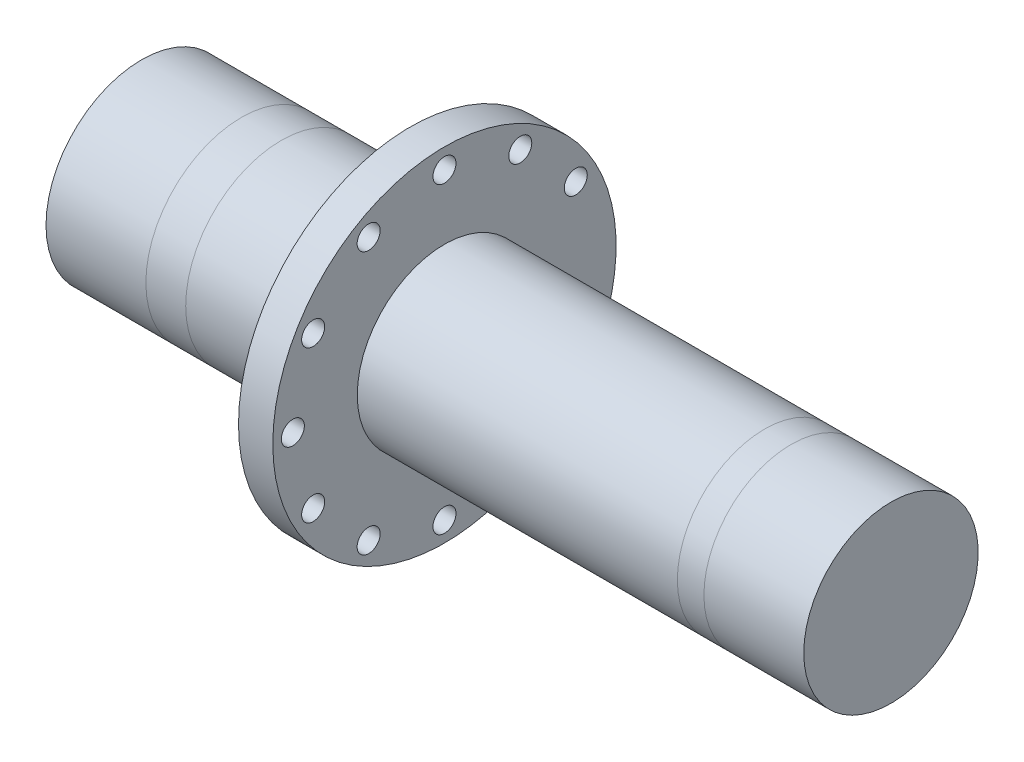
ISO-10303-21;
HEADER;
FILE_DESCRIPTION(('STEP AP214'),'2;1');
FILE_NAME('part.step','',(''),(''),'','','');
FILE_SCHEMA(('AUTOMOTIVE_DESIGN { 1 0 10303 214 1 1 1 1 }'));
ENDSEC;
DATA;
#1=APPLICATION_CONTEXT('core data for automotive mechanical design processes');
#2=APPLICATION_PROTOCOL_DEFINITION('international standard','automotive_design',2000,#1);
#3=PRODUCT_CONTEXT('',#1,'mechanical');
#4=PRODUCT('Part','Part','',(#3));
#5=PRODUCT_RELATED_PRODUCT_CATEGORY('part','',(#4));
#6=PRODUCT_DEFINITION_FORMATION('','',#4);
#7=PRODUCT_DEFINITION_CONTEXT('part definition',#1,'design');
#8=PRODUCT_DEFINITION('design','',#6,#7);
#9=PRODUCT_DEFINITION_SHAPE('','',#8);
#10=(LENGTH_UNIT() NAMED_UNIT(*) SI_UNIT(.MILLI.,.METRE.));
#11=(NAMED_UNIT(*) PLANE_ANGLE_UNIT() SI_UNIT($,.RADIAN.));
#12=(NAMED_UNIT(*) SI_UNIT($,.STERADIAN.) SOLID_ANGLE_UNIT());
#13=UNCERTAINTY_MEASURE_WITH_UNIT(LENGTH_MEASURE(1.E-05),#10,'distance_accuracy_value','');
#14=(GEOMETRIC_REPRESENTATION_CONTEXT(3) GLOBAL_UNCERTAINTY_ASSIGNED_CONTEXT((#13)) GLOBAL_UNIT_ASSIGNED_CONTEXT((#10,
#11,#12)) REPRESENTATION_CONTEXT('',''));
#15=CARTESIAN_POINT('',(0.,0.,0.));
#16=DIRECTION('',(0.,0.,1.));
#17=DIRECTION('',(1.,0.,0.));
#18=AXIS2_PLACEMENT_3D('',#15,#16,#17);
#19=CARTESIAN_POINT('',(0.,0.,0.));
#20=DIRECTION('',(-1.,0.,0.));
#21=DIRECTION('',(0.,0.,1.));
#22=AXIS2_PLACEMENT_3D('',#19,#20,#21);
#23=CYLINDRICAL_SURFACE('',#22,25.019);
#24=CARTESIAN_POINT('',(178.729999896,0.,0.));
#25=DIRECTION('',(-1.,0.,0.));
#26=DIRECTION('',(0.,0.,-1.));
#27=AXIS2_PLACEMENT_3D('',#24,#25,#26);
#28=CIRCLE('',#27,25.019);
#29=CARTESIAN_POINT('',(178.729999896,0.,-25.019));
#30=VERTEX_POINT('',#29);
#31=EDGE_CURVE('E65',#30,#30,#28,.T.);
#32=ORIENTED_EDGE('',*,*,#31,.F.);
#33=EDGE_LOOP('',(#32));
#34=FACE_BOUND('',#33,.T.);
#35=CARTESIAN_POINT('',(186.349999896,0.,0.));
#36=DIRECTION('',(-1.,0.,0.));
#37=DIRECTION('',(0.,0.,-1.));
#38=AXIS2_PLACEMENT_3D('',#35,#36,#37);
#39=CIRCLE('',#38,25.019);
#40=CARTESIAN_POINT('',(186.349999896,0.,-25.019));
#41=VERTEX_POINT('',#40);
#42=EDGE_CURVE('E12',#41,#41,#39,.T.);
#43=ORIENTED_EDGE('',*,*,#42,.T.);
#44=EDGE_LOOP('',(#43));
#45=FACE_BOUND('',#44,.T.);
#46=ADVANCED_FACE('F55',(#34,#45),#23,.T.);
#47=CARTESIAN_POINT('',(86.8925,0.,0.));
#48=DIRECTION('',(-1.,0.,0.));
#49=DIRECTION('',(0.,0.,1.));
#50=AXIS2_PLACEMENT_3D('',#47,#48,#49);
#51=CIRCLE('',#50,25.019);
#52=CARTESIAN_POINT('',(86.8925,0.,25.019));
#53=VERTEX_POINT('',#52);
#54=EDGE_CURVE('E80',#53,#53,#51,.T.);
#55=ORIENTED_EDGE('',*,*,#54,.F.);
#56=EDGE_LOOP('',(#55));
#57=FACE_BOUND('',#56,.T.);
#58=ORIENTED_EDGE('',*,*,#31,.T.);
#59=EDGE_LOOP('',(#58));
#60=FACE_BOUND('',#59,.T.);
#61=ADVANCED_FACE('F141',(#57,#60),#23,.T.);
#62=CARTESIAN_POINT('',(0.,0.,0.));
#63=DIRECTION('',(-1.,0.,0.));
#64=DIRECTION('',(0.,0.,1.));
#65=AXIS2_PLACEMENT_3D('',#62,#63,#64);
#66=CYLINDRICAL_SURFACE('',#65,27.432);
#67=CARTESIAN_POINT('',(77.05,0.,0.));
#68=DIRECTION('',(-1.,0.,0.));
#69=DIRECTION('',(0.,0.,1.));
#70=AXIS2_PLACEMENT_3D('',#67,#68,#69);
#71=CIRCLE('',#70,27.432);
#72=CARTESIAN_POINT('',(77.05,0.,27.432));
#73=VERTEX_POINT('',#72);
#74=EDGE_CURVE('E112',#73,#73,#71,.T.);
#75=ORIENTED_EDGE('',*,*,#74,.T.);
#76=EDGE_LOOP('',(#75));
#77=FACE_BOUND('',#76,.T.);
#78=CARTESIAN_POINT('',(40.080000104,0.,0.));
#79=DIRECTION('',(1.,0.,0.));
#80=DIRECTION('',(0.,0.,1.));
#81=AXIS2_PLACEMENT_3D('',#78,#79,#80);
#82=CIRCLE('',#81,27.432);
#83=CARTESIAN_POINT('',(40.080000104,0.,27.432));
#84=VERTEX_POINT('',#83);
#85=EDGE_CURVE('E70',#84,#84,#82,.T.);
#86=ORIENTED_EDGE('',*,*,#85,.T.);
#87=EDGE_LOOP('',(#86));
#88=FACE_BOUND('',#87,.T.);
#89=ADVANCED_FACE('F150',(#77,#88),#66,.T.);
#90=ORIENTED_EDGE('',*,*,#85,.F.);
#91=EDGE_LOOP('',(#90));
#92=FACE_BOUND('',#91,.T.);
#93=CARTESIAN_POINT('',(28.650000104,0.,0.));
#94=DIRECTION('',(1.,0.,0.));
#95=DIRECTION('',(0.,0.,1.));
#96=AXIS2_PLACEMENT_3D('',#93,#94,#95);
#97=CIRCLE('',#96,27.432);
#98=CARTESIAN_POINT('',(28.650000104,0.,27.432));
#99=VERTEX_POINT('',#98);
#100=EDGE_CURVE('E76',#99,#99,#97,.T.);
#101=ORIENTED_EDGE('',*,*,#100,.T.);
#102=EDGE_LOOP('',(#101));
#103=FACE_BOUND('',#102,.T.);
#104=ADVANCED_FACE('F139',(#92,#103),#66,.T.);
#105=ORIENTED_EDGE('',*,*,#42,.F.);
#106=EDGE_LOOP('',(#105));
#107=FACE_BOUND('',#106,.T.);
#108=CARTESIAN_POINT('',(215.,0.,0.));
#109=DIRECTION('',(-1.,0.,0.));
#110=DIRECTION('',(0.,0.,1.));
#111=AXIS2_PLACEMENT_3D('',#108,#109,#110);
#112=CIRCLE('',#111,25.019);
#113=CARTESIAN_POINT('',(215.,0.,25.019));
#114=VERTEX_POINT('',#113);
#115=EDGE_CURVE('E104',#114,#114,#112,.T.);
#116=ORIENTED_EDGE('',*,*,#115,.T.);
#117=EDGE_LOOP('',(#116));
#118=FACE_BOUND('',#117,.T.);
#119=ADVANCED_FACE('F57',(#107,#118),#23,.T.);
#120=CARTESIAN_POINT('',(86.8925,0.,0.));
#121=DIRECTION('',(1.,0.,0.));
#122=DIRECTION('',(0.,0.,-1.));
#123=AXIS2_PLACEMENT_3D('',#120,#121,#122);
#124=PLANE('',#123);
#125=CARTESIAN_POINT('',(86.8925,-21.7500001666548,-37.6721052312784));
#126=DIRECTION('',(1.,0.,0.));
#127=DIRECTION('',(0.,0.,-1.));
#128=AXIS2_PLACEMENT_3D('',#125,#126,#127);
#129=CIRCLE('',#128,3.29999999999998);
#130=CARTESIAN_POINT('',(86.8925,-21.7500001666548,-40.9721052312783));
#131=VERTEX_POINT('',#130);
#132=EDGE_CURVE('E276',#131,#131,#129,.T.);
#133=ORIENTED_EDGE('',*,*,#132,.F.);
#134=EDGE_LOOP('',(#133));
#135=FACE_BOUND('',#134,.T.);
#136=CARTESIAN_POINT('',(86.8925,-37.6721052759331,-21.7500001220003));
#137=DIRECTION('',(1.,0.,0.));
#138=DIRECTION('',(0.,0.,-1.));
#139=AXIS2_PLACEMENT_3D('',#136,#137,#138);
#140=CIRCLE('',#139,3.29999999999998);
#141=CARTESIAN_POINT('',(86.8925,-37.6721052759331,-25.0500001220003));
#142=VERTEX_POINT('',#141);
#143=EDGE_CURVE('E289',#142,#142,#140,.T.);
#144=ORIENTED_EDGE('',*,*,#143,.F.);
#145=EDGE_LOOP('',(#144));
#146=FACE_BOUND('',#145,.T.);
#147=CARTESIAN_POINT('',(86.8925,-43.5000002276551,-6.10002881540339E-08));
#148=DIRECTION('',(1.,0.,0.));
#149=DIRECTION('',(0.,0.,-1.));
#150=AXIS2_PLACEMENT_3D('',#147,#148,#149);
#151=CIRCLE('',#150,3.29999999999998);
#152=CARTESIAN_POINT('',(86.8925,-43.5000002276551,-3.30000006100026));
#153=VERTEX_POINT('',#152);
#154=EDGE_CURVE('E295',#153,#153,#151,.T.);
#155=ORIENTED_EDGE('',*,*,#154,.F.);
#156=EDGE_LOOP('',(#155));
#157=FACE_BOUND('',#156,.T.);
#158=CARTESIAN_POINT('',(86.8925,-37.6721052759334,21.7499999999998));
#159=DIRECTION('',(1.,0.,0.));
#160=DIRECTION('',(0.,0.,-1.));
#161=AXIS2_PLACEMENT_3D('',#158,#159,#160);
#162=CIRCLE('',#161,3.29999999999998);
#163=CARTESIAN_POINT('',(86.8925,-37.6721052759334,18.4499999999998));
#164=VERTEX_POINT('',#163);
#165=EDGE_CURVE('E302',#164,#164,#162,.T.);
#166=ORIENTED_EDGE('',*,*,#165,.F.);
#167=EDGE_LOOP('',(#166));
#168=FACE_BOUND('',#167,.T.);
#169=CARTESIAN_POINT('',(86.8925,-21.7500001666553,37.6721051092781));
#170=DIRECTION('',(1.,0.,0.));
#171=DIRECTION('',(0.,0.,-1.));
#172=AXIS2_PLACEMENT_3D('',#169,#170,#171);
#173=CIRCLE('',#172,3.29999999999998);
#174=CARTESIAN_POINT('',(86.8925,-21.7500001666553,34.3721051092781));
#175=VERTEX_POINT('',#174);
#176=EDGE_CURVE('E312',#175,#175,#173,.T.);
#177=ORIENTED_EDGE('',*,*,#176,.F.);
#178=EDGE_LOOP('',(#177));
#179=FACE_BOUND('',#178,.T.);
#180=CARTESIAN_POINT('',(86.8925,-1.05655234561297E-07,43.500000061));
#181=DIRECTION('',(1.,0.,0.));
#182=DIRECTION('',(0.,0.,-1.));
#183=AXIS2_PLACEMENT_3D('',#180,#181,#182);
#184=CIRCLE('',#183,3.29999999999998);
#185=CARTESIAN_POINT('',(86.8925,-1.05655234561297E-07,40.200000061));
#186=VERTEX_POINT('',#185);
#187=EDGE_CURVE('E318',#186,#186,#184,.T.);
#188=ORIENTED_EDGE('',*,*,#187,.F.);
#189=EDGE_LOOP('',(#188));
#190=FACE_BOUND('',#189,.T.);
#191=CARTESIAN_POINT('',(86.8925,21.7499999553448,37.6721051092782));
#192=DIRECTION('',(1.,0.,0.));
#193=DIRECTION('',(0.,0.,-1.));
#194=AXIS2_PLACEMENT_3D('',#191,#192,#193);
#195=CIRCLE('',#194,3.29999999999998);
#196=CARTESIAN_POINT('',(86.8925,21.7499999553448,34.3721051092783));
#197=VERTEX_POINT('',#196);
#198=EDGE_CURVE('E325',#197,#197,#195,.T.);
#199=ORIENTED_EDGE('',*,*,#198,.F.);
#200=EDGE_LOOP('',(#199));
#201=FACE_BOUND('',#200,.T.);
#202=CARTESIAN_POINT('',(86.8925,37.6721050646231,21.75));
#203=DIRECTION('',(1.,0.,0.));
#204=DIRECTION('',(0.,0.,-1.));
#205=AXIS2_PLACEMENT_3D('',#202,#203,#204);
#206=CIRCLE('',#205,3.29999999999998);
#207=CARTESIAN_POINT('',(86.8925,37.6721050646231,18.4500000000001));
#208=VERTEX_POINT('',#207);
#209=EDGE_CURVE('E331',#208,#208,#206,.T.);
#210=ORIENTED_EDGE('',*,*,#209,.F.);
#211=EDGE_LOOP('',(#210));
#212=FACE_BOUND('',#211,.T.);
#213=CARTESIAN_POINT('',(86.8925,43.5000000163449,-6.09999828427021E-08));
#214=DIRECTION('',(1.,0.,0.));
#215=DIRECTION('',(0.,0.,-1.));
#216=AXIS2_PLACEMENT_3D('',#213,#214,#215);
#217=CIRCLE('',#216,3.29999999999998);
#218=CARTESIAN_POINT('',(86.8925,43.5000000163449,-3.30000006099996));
#219=VERTEX_POINT('',#218);
#220=EDGE_CURVE('E337',#219,#219,#217,.T.);
#221=ORIENTED_EDGE('',*,*,#220,.F.);
#222=EDGE_LOOP('',(#221));
#223=FACE_BOUND('',#222,.T.);
#224=CARTESIAN_POINT('',(86.8925,37.6721050646231,-21.750000122));
#225=DIRECTION('',(1.,0.,0.));
#226=DIRECTION('',(0.,0.,-1.));
#227=AXIS2_PLACEMENT_3D('',#224,#225,#226);
#228=CIRCLE('',#227,3.29999999999998);
#229=CARTESIAN_POINT('',(86.8925,37.6721050646231,-25.050000122));
#230=VERTEX_POINT('',#229);
#231=EDGE_CURVE('E93',#230,#230,#228,.T.);
#232=ORIENTED_EDGE('',*,*,#231,.F.);
#233=EDGE_LOOP('',(#232));
#234=FACE_BOUND('',#233,.T.);
#235=CARTESIAN_POINT('',(86.8925,21.7499999553448,-37.6721052312782));
#236=DIRECTION('',(1.,0.,0.));
#237=DIRECTION('',(0.,0.,-1.));
#238=AXIS2_PLACEMENT_3D('',#235,#236,#237);
#239=CIRCLE('',#238,3.29999999999998);
#240=CARTESIAN_POINT('',(86.8925,21.7499999553448,-40.9721052312782));
#241=VERTEX_POINT('',#240);
#242=EDGE_CURVE('E59',#241,#241,#239,.T.);
#243=ORIENTED_EDGE('',*,*,#242,.F.);
#244=EDGE_LOOP('',(#243));
#245=FACE_BOUND('',#244,.T.);
#246=ORIENTED_EDGE('',*,*,#54,.T.);
#247=EDGE_LOOP('',(#246));
#248=FACE_BOUND('',#247,.T.);
#249=CARTESIAN_POINT('',(86.8925,0.,0.));
#250=DIRECTION('',(-1.,0.,0.));
#251=DIRECTION('',(0.,0.,1.));
#252=AXIS2_PLACEMENT_3D('',#249,#250,#251);
#253=CIRCLE('',#252,49.25);
#254=CARTESIAN_POINT('',(86.8925,0.,49.25));
#255=VERTEX_POINT('',#254);
#256=EDGE_CURVE('E84',#255,#255,#253,.T.);
#257=ORIENTED_EDGE('',*,*,#256,.F.);
#258=EDGE_LOOP('',(#257));
#259=FACE_BOUND('',#258,.T.);
#260=ADVANCED_FACE('F130',(#135,#146,#157,#168,#179,#190,#201,#212,#223,#234,#245,#248,#259),
#124,.T.);
#261=CARTESIAN_POINT('',(0.,0.,0.));
#262=DIRECTION('',(-1.,0.,0.));
#263=DIRECTION('',(0.,0.,1.));
#264=AXIS2_PLACEMENT_3D('',#261,#262,#263);
#265=CYLINDRICAL_SURFACE('',#264,49.25);
#266=ORIENTED_EDGE('',*,*,#256,.T.);
#267=EDGE_LOOP('',(#266));
#268=FACE_BOUND('',#267,.T.);
#269=CARTESIAN_POINT('',(77.05,0.,0.));
#270=DIRECTION('',(-1.,0.,0.));
#271=DIRECTION('',(0.,0.,1.));
#272=AXIS2_PLACEMENT_3D('',#269,#270,#271);
#273=CIRCLE('',#272,49.25);
#274=CARTESIAN_POINT('',(77.05,0.,49.25));
#275=VERTEX_POINT('',#274);
#276=EDGE_CURVE('E115',#275,#275,#273,.T.);
#277=ORIENTED_EDGE('',*,*,#276,.F.);
#278=EDGE_LOOP('',(#277));
#279=FACE_BOUND('',#278,.T.);
#280=ADVANCED_FACE('F127',(#268,#279),#265,.T.);
#281=CARTESIAN_POINT('',(77.05,0.,0.));
#282=DIRECTION('',(-1.,0.,0.));
#283=DIRECTION('',(0.,0.,1.));
#284=AXIS2_PLACEMENT_3D('',#281,#282,#283);
#285=PLANE('',#284);
#286=CARTESIAN_POINT('',(77.05,-21.7500001666548,-37.6721052312784));
#287=DIRECTION('',(-1.,0.,0.));
#288=DIRECTION('',(0.,0.,1.));
#289=AXIS2_PLACEMENT_3D('',#286,#287,#288);
#290=CIRCLE('',#289,3.29999999999999);
#291=CARTESIAN_POINT('',(77.05,-21.7500001666548,-34.3721052312784));
#292=VERTEX_POINT('',#291);
#293=EDGE_CURVE('E188',#292,#292,#290,.T.);
#294=ORIENTED_EDGE('',*,*,#293,.F.);
#295=EDGE_LOOP('',(#294));
#296=FACE_BOUND('',#295,.T.);
#297=CARTESIAN_POINT('',(77.05,-37.6721052759331,-21.7500001220003));
#298=DIRECTION('',(-1.,0.,0.));
#299=DIRECTION('',(0.,0.,1.));
#300=AXIS2_PLACEMENT_3D('',#297,#298,#299);
#301=CIRCLE('',#300,3.29999999999999);
#302=CARTESIAN_POINT('',(77.05,-37.6721052759331,-18.4500001220003));
#303=VERTEX_POINT('',#302);
#304=EDGE_CURVE('E192',#303,#303,#301,.T.);
#305=ORIENTED_EDGE('',*,*,#304,.F.);
#306=EDGE_LOOP('',(#305));
#307=FACE_BOUND('',#306,.T.);
#308=CARTESIAN_POINT('',(77.05,-43.5000002276551,-6.10002881540339E-08));
#309=DIRECTION('',(-1.,0.,0.));
#310=DIRECTION('',(0.,0.,1.));
#311=AXIS2_PLACEMENT_3D('',#308,#309,#310);
#312=CIRCLE('',#311,3.29999999999998);
#313=CARTESIAN_POINT('',(77.05,-43.5000002276551,3.2999999389997));
#314=VERTEX_POINT('',#313);
#315=EDGE_CURVE('E196',#314,#314,#312,.T.);
#316=ORIENTED_EDGE('',*,*,#315,.F.);
#317=EDGE_LOOP('',(#316));
#318=FACE_BOUND('',#317,.T.);
#319=CARTESIAN_POINT('',(77.05,-37.6721052759334,21.7499999999998));
#320=DIRECTION('',(-1.,0.,0.));
#321=DIRECTION('',(0.,0.,1.));
#322=AXIS2_PLACEMENT_3D('',#319,#320,#321);
#323=CIRCLE('',#322,3.29999999999998);
#324=CARTESIAN_POINT('',(77.05,-37.6721052759334,25.0499999999998));
#325=VERTEX_POINT('',#324);
#326=EDGE_CURVE('E200',#325,#325,#323,.T.);
#327=ORIENTED_EDGE('',*,*,#326,.F.);
#328=EDGE_LOOP('',(#327));
#329=FACE_BOUND('',#328,.T.);
#330=CARTESIAN_POINT('',(77.05,-21.7500001666553,37.6721051092781));
#331=DIRECTION('',(-1.,0.,0.));
#332=DIRECTION('',(0.,0.,1.));
#333=AXIS2_PLACEMENT_3D('',#330,#331,#332);
#334=CIRCLE('',#333,3.29999999999999);
#335=CARTESIAN_POINT('',(77.05,-21.7500001666553,40.9721051092781));
#336=VERTEX_POINT('',#335);
#337=EDGE_CURVE('E204',#336,#336,#334,.T.);
#338=ORIENTED_EDGE('',*,*,#337,.F.);
#339=EDGE_LOOP('',(#338));
#340=FACE_BOUND('',#339,.T.);
#341=CARTESIAN_POINT('',(77.05,-1.05655234561297E-07,43.500000061));
#342=DIRECTION('',(-1.,0.,0.));
#343=DIRECTION('',(0.,0.,1.));
#344=AXIS2_PLACEMENT_3D('',#341,#342,#343);
#345=CIRCLE('',#344,3.29999999999999);
#346=CARTESIAN_POINT('',(77.05,-1.05655234561297E-07,46.800000061));
#347=VERTEX_POINT('',#346);
#348=EDGE_CURVE('E208',#347,#347,#345,.T.);
#349=ORIENTED_EDGE('',*,*,#348,.F.);
#350=EDGE_LOOP('',(#349));
#351=FACE_BOUND('',#350,.T.);
#352=CARTESIAN_POINT('',(77.05,21.7499999553448,37.6721051092782));
#353=DIRECTION('',(-1.,0.,0.));
#354=DIRECTION('',(0.,0.,1.));
#355=AXIS2_PLACEMENT_3D('',#352,#353,#354);
#356=CIRCLE('',#355,3.29999999999999);
#357=CARTESIAN_POINT('',(77.05,21.7499999553448,40.9721051092782));
#358=VERTEX_POINT('',#357);
#359=EDGE_CURVE('E212',#358,#358,#356,.T.);
#360=ORIENTED_EDGE('',*,*,#359,.F.);
#361=EDGE_LOOP('',(#360));
#362=FACE_BOUND('',#361,.T.);
#363=CARTESIAN_POINT('',(77.05,37.6721050646231,21.75));
#364=DIRECTION('',(-1.,0.,0.));
#365=DIRECTION('',(0.,0.,1.));
#366=AXIS2_PLACEMENT_3D('',#363,#364,#365);
#367=CIRCLE('',#366,3.29999999999998);
#368=CARTESIAN_POINT('',(77.05,37.6721050646231,25.05));
#369=VERTEX_POINT('',#368);
#370=EDGE_CURVE('E216',#369,#369,#367,.T.);
#371=ORIENTED_EDGE('',*,*,#370,.F.);
#372=EDGE_LOOP('',(#371));
#373=FACE_BOUND('',#372,.T.);
#374=CARTESIAN_POINT('',(77.05,43.5000000163449,-6.09999828427021E-08));
#375=DIRECTION('',(-1.,0.,0.));
#376=DIRECTION('',(0.,0.,1.));
#377=AXIS2_PLACEMENT_3D('',#374,#375,#376);
#378=CIRCLE('',#377,3.29999999999998);
#379=CARTESIAN_POINT('',(77.05,43.5000000163449,3.299999939));
#380=VERTEX_POINT('',#379);
#381=EDGE_CURVE('E220',#380,#380,#378,.T.);
#382=ORIENTED_EDGE('',*,*,#381,.F.);
#383=EDGE_LOOP('',(#382));
#384=FACE_BOUND('',#383,.T.);
#385=CARTESIAN_POINT('',(77.05,37.6721050646231,-21.750000122));
#386=DIRECTION('',(-1.,0.,0.));
#387=DIRECTION('',(0.,0.,1.));
#388=AXIS2_PLACEMENT_3D('',#385,#386,#387);
#389=CIRCLE('',#388,3.29999999999998);
#390=CARTESIAN_POINT('',(77.05,37.6721050646231,-18.4500001220001));
#391=VERTEX_POINT('',#390);
#392=EDGE_CURVE('E100',#391,#391,#389,.T.);
#393=ORIENTED_EDGE('',*,*,#392,.F.);
#394=EDGE_LOOP('',(#393));
#395=FACE_BOUND('',#394,.T.);
#396=CARTESIAN_POINT('',(77.05,21.7499999553448,-37.6721052312782));
#397=DIRECTION('',(-1.,0.,0.));
#398=DIRECTION('',(0.,0.,1.));
#399=AXIS2_PLACEMENT_3D('',#396,#397,#398);
#400=CIRCLE('',#399,3.29999999999999);
#401=CARTESIAN_POINT('',(77.05,21.7499999553448,-34.3721052312782));
#402=VERTEX_POINT('',#401);
#403=EDGE_CURVE('E99',#402,#402,#400,.T.);
#404=ORIENTED_EDGE('',*,*,#403,.F.);
#405=EDGE_LOOP('',(#404));
#406=FACE_BOUND('',#405,.T.);
#407=ORIENTED_EDGE('',*,*,#276,.T.);
#408=EDGE_LOOP('',(#407));
#409=FACE_BOUND('',#408,.T.);
#410=ORIENTED_EDGE('',*,*,#74,.F.);
#411=EDGE_LOOP('',(#410));
#412=FACE_BOUND('',#411,.T.);
#413=ADVANCED_FACE('F136',(#296,#307,#318,#329,#340,#351,#362,#373,#384,#395,#406,#409,#412),
#285,.T.);
#414=ORIENTED_EDGE('',*,*,#100,.F.);
#415=EDGE_LOOP('',(#414));
#416=FACE_BOUND('',#415,.T.);
#417=CARTESIAN_POINT('',(0.,0.,0.));
#418=DIRECTION('',(-1.,0.,0.));
#419=DIRECTION('',(0.,0.,1.));
#420=AXIS2_PLACEMENT_3D('',#417,#418,#419);
#421=CIRCLE('',#420,27.432);
#422=CARTESIAN_POINT('',(0.,0.,27.432));
#423=VERTEX_POINT('',#422);
#424=EDGE_CURVE('E108',#423,#423,#421,.T.);
#425=ORIENTED_EDGE('',*,*,#424,.F.);
#426=EDGE_LOOP('',(#425));
#427=FACE_BOUND('',#426,.T.);
#428=ADVANCED_FACE('F158',(#416,#427),#66,.T.);
#429=CARTESIAN_POINT('',(0.,0.,0.));
#430=DIRECTION('',(-1.,0.,0.));
#431=DIRECTION('',(0.,0.,1.));
#432=AXIS2_PLACEMENT_3D('',#429,#430,#431);
#433=PLANE('',#432);
#434=ORIENTED_EDGE('',*,*,#424,.T.);
#435=EDGE_LOOP('',(#434));
#436=FACE_BOUND('',#435,.T.);
#437=ADVANCED_FACE('F168',(#436),#433,.T.);
#438=CARTESIAN_POINT('',(215.,0.,0.));
#439=DIRECTION('',(-1.,0.,0.));
#440=DIRECTION('',(0.,0.,1.));
#441=AXIS2_PLACEMENT_3D('',#438,#439,#440);
#442=PLANE('',#441);
#443=ORIENTED_EDGE('',*,*,#115,.F.);
#444=EDGE_LOOP('',(#443));
#445=FACE_BOUND('',#444,.T.);
#446=ADVANCED_FACE('F174',(#445),#442,.F.);
#447=CARTESIAN_POINT('',(77.05,21.7499999553448,-37.6721052312782));
#448=DIRECTION('',(-1.,0.,0.));
#449=DIRECTION('',(0.,0.,1.));
#450=AXIS2_PLACEMENT_3D('',#447,#448,#449);
#451=CYLINDRICAL_SURFACE('',#450,3.29999999999998);
#452=ORIENTED_EDGE('',*,*,#242,.T.);
#453=EDGE_LOOP('',(#452));
#454=FACE_BOUND('',#453,.T.);
#455=ORIENTED_EDGE('',*,*,#403,.T.);
#456=EDGE_LOOP('',(#455));
#457=FACE_BOUND('',#456,.T.);
#458=ADVANCED_FACE('F228',(#454,#457),#451,.F.);
#459=CARTESIAN_POINT('',(77.05,37.6721050646231,-21.750000122));
#460=DIRECTION('',(-1.,0.,0.));
#461=DIRECTION('',(0.,0.,1.));
#462=AXIS2_PLACEMENT_3D('',#459,#460,#461);
#463=CYLINDRICAL_SURFACE('',#462,3.29999999999998);
#464=ORIENTED_EDGE('',*,*,#231,.T.);
#465=EDGE_LOOP('',(#464));
#466=FACE_BOUND('',#465,.T.);
#467=ORIENTED_EDGE('',*,*,#392,.T.);
#468=EDGE_LOOP('',(#467));
#469=FACE_BOUND('',#468,.T.);
#470=ADVANCED_FACE('F229',(#466,#469),#463,.F.);
#471=CARTESIAN_POINT('',(77.05,43.5000000163449,-6.09999828427021E-08));
#472=DIRECTION('',(-1.,0.,0.));
#473=DIRECTION('',(0.,0.,1.));
#474=AXIS2_PLACEMENT_3D('',#471,#472,#473);
#475=CYLINDRICAL_SURFACE('',#474,3.29999999999998);
#476=ORIENTED_EDGE('',*,*,#220,.T.);
#477=EDGE_LOOP('',(#476));
#478=FACE_BOUND('',#477,.T.);
#479=ORIENTED_EDGE('',*,*,#381,.T.);
#480=EDGE_LOOP('',(#479));
#481=FACE_BOUND('',#480,.T.);
#482=ADVANCED_FACE('F233',(#478,#481),#475,.F.);
#483=CARTESIAN_POINT('',(77.05,37.6721050646231,21.75));
#484=DIRECTION('',(-1.,0.,0.));
#485=DIRECTION('',(0.,0.,1.));
#486=AXIS2_PLACEMENT_3D('',#483,#484,#485);
#487=CYLINDRICAL_SURFACE('',#486,3.29999999999998);
#488=ORIENTED_EDGE('',*,*,#209,.T.);
#489=EDGE_LOOP('',(#488));
#490=FACE_BOUND('',#489,.T.);
#491=ORIENTED_EDGE('',*,*,#370,.T.);
#492=EDGE_LOOP('',(#491));
#493=FACE_BOUND('',#492,.T.);
#494=ADVANCED_FACE('F242',(#490,#493),#487,.F.);
#495=CARTESIAN_POINT('',(77.05,21.7499999553448,37.6721051092782));
#496=DIRECTION('',(-1.,0.,0.));
#497=DIRECTION('',(0.,0.,1.));
#498=AXIS2_PLACEMENT_3D('',#495,#496,#497);
#499=CYLINDRICAL_SURFACE('',#498,3.29999999999998);
#500=ORIENTED_EDGE('',*,*,#198,.T.);
#501=EDGE_LOOP('',(#500));
#502=FACE_BOUND('',#501,.T.);
#503=ORIENTED_EDGE('',*,*,#359,.T.);
#504=EDGE_LOOP('',(#503));
#505=FACE_BOUND('',#504,.T.);
#506=ADVANCED_FACE('F246',(#502,#505),#499,.F.);
#507=CARTESIAN_POINT('',(77.05,-1.05655234561297E-07,43.500000061));
#508=DIRECTION('',(-1.,0.,0.));
#509=DIRECTION('',(0.,0.,1.));
#510=AXIS2_PLACEMENT_3D('',#507,#508,#509);
#511=CYLINDRICAL_SURFACE('',#510,3.29999999999998);
#512=ORIENTED_EDGE('',*,*,#187,.T.);
#513=EDGE_LOOP('',(#512));
#514=FACE_BOUND('',#513,.T.);
#515=ORIENTED_EDGE('',*,*,#348,.T.);
#516=EDGE_LOOP('',(#515));
#517=FACE_BOUND('',#516,.T.);
#518=ADVANCED_FACE('F250',(#514,#517),#511,.F.);
#519=CARTESIAN_POINT('',(77.05,-21.7500001666553,37.6721051092781));
#520=DIRECTION('',(-1.,0.,0.));
#521=DIRECTION('',(0.,0.,1.));
#522=AXIS2_PLACEMENT_3D('',#519,#520,#521);
#523=CYLINDRICAL_SURFACE('',#522,3.29999999999998);
#524=ORIENTED_EDGE('',*,*,#176,.T.);
#525=EDGE_LOOP('',(#524));
#526=FACE_BOUND('',#525,.T.);
#527=ORIENTED_EDGE('',*,*,#337,.T.);
#528=EDGE_LOOP('',(#527));
#529=FACE_BOUND('',#528,.T.);
#530=ADVANCED_FACE('F254',(#526,#529),#523,.F.);
#531=CARTESIAN_POINT('',(77.05,-37.6721052759334,21.7499999999998));
#532=DIRECTION('',(-1.,0.,0.));
#533=DIRECTION('',(0.,0.,1.));
#534=AXIS2_PLACEMENT_3D('',#531,#532,#533);
#535=CYLINDRICAL_SURFACE('',#534,3.29999999999998);
#536=ORIENTED_EDGE('',*,*,#165,.T.);
#537=EDGE_LOOP('',(#536));
#538=FACE_BOUND('',#537,.T.);
#539=ORIENTED_EDGE('',*,*,#326,.T.);
#540=EDGE_LOOP('',(#539));
#541=FACE_BOUND('',#540,.T.);
#542=ADVANCED_FACE('F258',(#538,#541),#535,.F.);
#543=CARTESIAN_POINT('',(77.05,-43.5000002276551,-6.10002881540339E-08));
#544=DIRECTION('',(-1.,0.,0.));
#545=DIRECTION('',(0.,0.,1.));
#546=AXIS2_PLACEMENT_3D('',#543,#544,#545);
#547=CYLINDRICAL_SURFACE('',#546,3.29999999999998);
#548=ORIENTED_EDGE('',*,*,#154,.T.);
#549=EDGE_LOOP('',(#548));
#550=FACE_BOUND('',#549,.T.);
#551=ORIENTED_EDGE('',*,*,#315,.T.);
#552=EDGE_LOOP('',(#551));
#553=FACE_BOUND('',#552,.T.);
#554=ADVANCED_FACE('F262',(#550,#553),#547,.F.);
#555=CARTESIAN_POINT('',(77.05,-37.6721052759331,-21.7500001220003));
#556=DIRECTION('',(-1.,0.,0.));
#557=DIRECTION('',(0.,0.,1.));
#558=AXIS2_PLACEMENT_3D('',#555,#556,#557);
#559=CYLINDRICAL_SURFACE('',#558,3.29999999999998);
#560=ORIENTED_EDGE('',*,*,#143,.T.);
#561=EDGE_LOOP('',(#560));
#562=FACE_BOUND('',#561,.T.);
#563=ORIENTED_EDGE('',*,*,#304,.T.);
#564=EDGE_LOOP('',(#563));
#565=FACE_BOUND('',#564,.T.);
#566=ADVANCED_FACE('F266',(#562,#565),#559,.F.);
#567=CARTESIAN_POINT('',(77.05,-21.7500001666548,-37.6721052312784));
#568=DIRECTION('',(-1.,0.,0.));
#569=DIRECTION('',(0.,0.,1.));
#570=AXIS2_PLACEMENT_3D('',#567,#568,#569);
#571=CYLINDRICAL_SURFACE('',#570,3.29999999999998);
#572=ORIENTED_EDGE('',*,*,#132,.T.);
#573=EDGE_LOOP('',(#572));
#574=FACE_BOUND('',#573,.T.);
#575=ORIENTED_EDGE('',*,*,#293,.T.);
#576=EDGE_LOOP('',(#575));
#577=FACE_BOUND('',#576,.T.);
#578=ADVANCED_FACE('F270',(#574,#577),#571,.F.);
#579=CLOSED_SHELL('',(#46,#61,#89,#104,#119,#260,#280,#413,#428,#437,#446,#458,#470,#482,#494,
#506,#518,#530,#542,#554,#566,#578));
#580=MANIFOLD_SOLID_BREP('B2',#579);
#581=ADVANCED_BREP_SHAPE_REPRESENTATION('',(#18,#580),#14);
#582=SHAPE_DEFINITION_REPRESENTATION(#9,#581);
ENDSEC;
END-ISO-10303-21;
